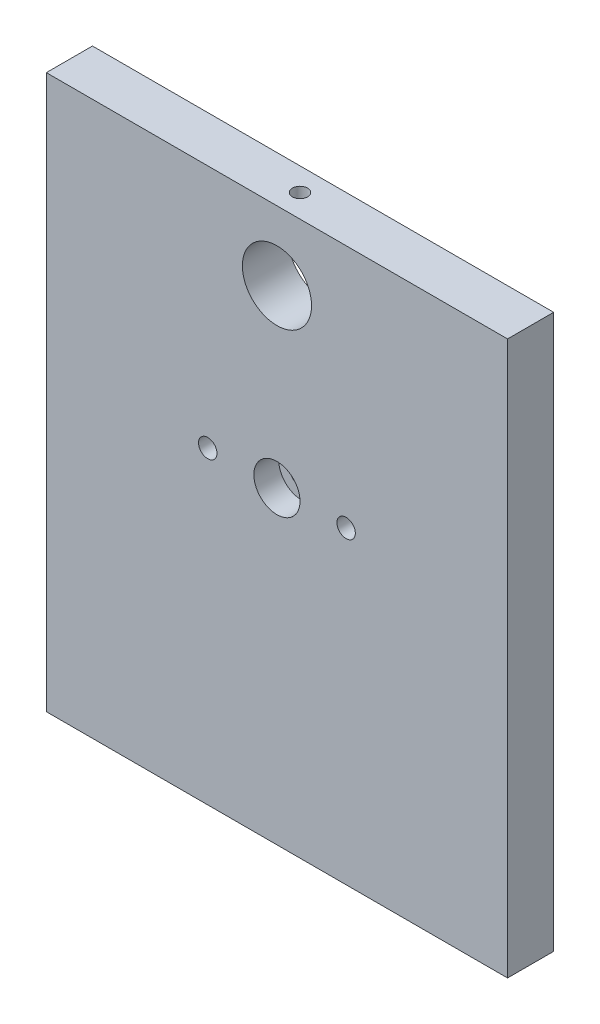
ISO-10303-21;
HEADER;
FILE_DESCRIPTION(('STEP AP214'),'2;1');
FILE_NAME('part.step','',(''),(''),'','','');
FILE_SCHEMA(('AUTOMOTIVE_DESIGN { 1 0 10303 214 1 1 1 1 }'));
ENDSEC;
DATA;
#1=APPLICATION_CONTEXT('core data for automotive mechanical design processes');
#2=APPLICATION_PROTOCOL_DEFINITION('international standard','automotive_design',2000,#1);
#3=PRODUCT_CONTEXT('',#1,'mechanical');
#4=PRODUCT('Part','Part','',(#3));
#5=PRODUCT_RELATED_PRODUCT_CATEGORY('part','',(#4));
#6=PRODUCT_DEFINITION_FORMATION('','',#4);
#7=PRODUCT_DEFINITION_CONTEXT('part definition',#1,'design');
#8=PRODUCT_DEFINITION('design','',#6,#7);
#9=PRODUCT_DEFINITION_SHAPE('','',#8);
#10=(LENGTH_UNIT() NAMED_UNIT(*) SI_UNIT(.MILLI.,.METRE.));
#11=(NAMED_UNIT(*) PLANE_ANGLE_UNIT() SI_UNIT($,.RADIAN.));
#12=(NAMED_UNIT(*) SI_UNIT($,.STERADIAN.) SOLID_ANGLE_UNIT());
#13=UNCERTAINTY_MEASURE_WITH_UNIT(LENGTH_MEASURE(1.E-05),#10,'distance_accuracy_value','');
#14=(GEOMETRIC_REPRESENTATION_CONTEXT(3) GLOBAL_UNCERTAINTY_ASSIGNED_CONTEXT((#13)) GLOBAL_UNIT_ASSIGNED_CONTEXT((#10,
#11,#12)) REPRESENTATION_CONTEXT('',''));
#15=CARTESIAN_POINT('',(0.,0.,0.));
#16=DIRECTION('',(0.,0.,1.));
#17=DIRECTION('',(1.,0.,0.));
#18=AXIS2_PLACEMENT_3D('',#15,#16,#17);
#19=CARTESIAN_POINT('',(-50.,0.,10.));
#20=DIRECTION('',(1.,0.,0.));
#21=DIRECTION('',(0.,0.,-1.));
#22=AXIS2_PLACEMENT_3D('',#19,#20,#21);
#23=PLANE('',#22);
#24=DIRECTION('',(0.,-1.,0.));
#25=VECTOR('',#24,1.);
#26=CARTESIAN_POINT('',(-50.,0.,0.));
#27=LINE('',#26,#25);
#28=CARTESIAN_POINT('',(-50.,120.,0.));
#29=VERTEX_POINT('',#28);
#30=CARTESIAN_POINT('',(-50.,0.,0.));
#31=VERTEX_POINT('',#30);
#32=EDGE_CURVE('E156',#29,#31,#27,.T.);
#33=ORIENTED_EDGE('',*,*,#32,.T.);
#34=DIRECTION('',(0.,0.,-1.));
#35=VECTOR('',#34,1.);
#36=CARTESIAN_POINT('',(-50.,0.,10.));
#37=LINE('',#36,#35);
#38=CARTESIAN_POINT('',(-50.,0.,10.));
#39=VERTEX_POINT('',#38);
#40=EDGE_CURVE('E11',#39,#31,#37,.T.);
#41=ORIENTED_EDGE('',*,*,#40,.F.);
#42=DIRECTION('',(0.,-1.,0.));
#43=VECTOR('',#42,1.);
#44=CARTESIAN_POINT('',(-50.,0.,10.));
#45=LINE('',#44,#43);
#46=CARTESIAN_POINT('',(-50.,120.,10.));
#47=VERTEX_POINT('',#46);
#48=EDGE_CURVE('E157',#47,#39,#45,.T.);
#49=ORIENTED_EDGE('',*,*,#48,.F.);
#50=DIRECTION('',(0.,0.,-1.));
#51=VECTOR('',#50,1.);
#52=CARTESIAN_POINT('',(-50.,120.,10.));
#53=LINE('',#52,#51);
#54=EDGE_CURVE('E167',#47,#29,#53,.T.);
#55=ORIENTED_EDGE('',*,*,#54,.T.);
#56=EDGE_LOOP('',(#33,#41,#49,#55));
#57=FACE_BOUND('',#56,.T.);
#58=ADVANCED_FACE('F44',(#57),#23,.F.);
#59=CARTESIAN_POINT('',(-50.,0.,10.));
#60=DIRECTION('',(0.,1.,0.));
#61=DIRECTION('',(0.,0.,1.));
#62=AXIS2_PLACEMENT_3D('',#59,#60,#61);
#63=PLANE('',#62);
#64=CARTESIAN_POINT('',(0.,0.,5.));
#65=DIRECTION('',(0.,-1.,0.));
#66=DIRECTION('',(0.,0.,-1.));
#67=AXIS2_PLACEMENT_3D('',#64,#65,#66);
#68=CIRCLE('',#67,2.09999999999999);
#69=CARTESIAN_POINT('',(0.,0.,2.90000000000001));
#70=VERTEX_POINT('',#69);
#71=EDGE_CURVE('E128',#70,#70,#68,.T.);
#72=ORIENTED_EDGE('',*,*,#71,.F.);
#73=EDGE_LOOP('',(#72));
#74=FACE_BOUND('',#73,.T.);
#75=CARTESIAN_POINT('',(-35.,0.,5.));
#76=DIRECTION('',(0.,-1.,0.));
#77=DIRECTION('',(0.,0.,-1.));
#78=AXIS2_PLACEMENT_3D('',#75,#76,#77);
#79=CIRCLE('',#78,2.09999999999999);
#80=CARTESIAN_POINT('',(-35.,0.,2.90000000000001));
#81=VERTEX_POINT('',#80);
#82=EDGE_CURVE('E127',#81,#81,#79,.T.);
#83=ORIENTED_EDGE('',*,*,#82,.F.);
#84=EDGE_LOOP('',(#83));
#85=FACE_BOUND('',#84,.T.);
#86=CARTESIAN_POINT('',(35.,0.,5.));
#87=DIRECTION('',(0.,-1.,0.));
#88=DIRECTION('',(0.,0.,-1.));
#89=AXIS2_PLACEMENT_3D('',#86,#87,#88);
#90=CIRCLE('',#89,2.09999999999999);
#91=CARTESIAN_POINT('',(35.,0.,2.90000000000001));
#92=VERTEX_POINT('',#91);
#93=EDGE_CURVE('E143',#92,#92,#90,.T.);
#94=ORIENTED_EDGE('',*,*,#93,.F.);
#95=EDGE_LOOP('',(#94));
#96=FACE_BOUND('',#95,.T.);
#97=DIRECTION('',(1.,0.,0.));
#98=VECTOR('',#97,1.);
#99=CARTESIAN_POINT('',(-50.,0.,0.));
#100=LINE('',#99,#98);
#101=CARTESIAN_POINT('',(50.,0.,0.));
#102=VERTEX_POINT('',#101);
#103=EDGE_CURVE('E171',#31,#102,#100,.T.);
#104=ORIENTED_EDGE('',*,*,#103,.T.);
#105=DIRECTION('',(0.,0.,-1.));
#106=VECTOR('',#105,1.);
#107=CARTESIAN_POINT('',(50.,0.,10.));
#108=LINE('',#107,#106);
#109=CARTESIAN_POINT('',(50.,0.,10.));
#110=VERTEX_POINT('',#109);
#111=EDGE_CURVE('E59',#110,#102,#108,.T.);
#112=ORIENTED_EDGE('',*,*,#111,.F.);
#113=DIRECTION('',(1.,0.,0.));
#114=VECTOR('',#113,1.);
#115=CARTESIAN_POINT('',(-50.,0.,10.));
#116=LINE('',#115,#114);
#117=EDGE_CURVE('E103',#39,#110,#116,.T.);
#118=ORIENTED_EDGE('',*,*,#117,.F.);
#119=ORIENTED_EDGE('',*,*,#40,.T.);
#120=EDGE_LOOP('',(#104,#112,#118,#119));
#121=FACE_BOUND('',#120,.T.);
#122=ADVANCED_FACE('F202',(#74,#85,#96,#121),#63,.F.);
#123=CARTESIAN_POINT('',(50.,0.,10.));
#124=DIRECTION('',(-1.,0.,0.));
#125=DIRECTION('',(0.,0.,1.));
#126=AXIS2_PLACEMENT_3D('',#123,#124,#125);
#127=PLANE('',#126);
#128=DIRECTION('',(0.,1.,0.));
#129=VECTOR('',#128,1.);
#130=CARTESIAN_POINT('',(50.,0.,0.));
#131=LINE('',#130,#129);
#132=CARTESIAN_POINT('',(50.,120.,0.));
#133=VERTEX_POINT('',#132);
#134=EDGE_CURVE('E89',#102,#133,#131,.T.);
#135=ORIENTED_EDGE('',*,*,#134,.T.);
#136=DIRECTION('',(0.,0.,-1.));
#137=VECTOR('',#136,1.);
#138=CARTESIAN_POINT('',(50.,120.,10.));
#139=LINE('',#138,#137);
#140=CARTESIAN_POINT('',(50.,120.,10.));
#141=VERTEX_POINT('',#140);
#142=EDGE_CURVE('E180',#141,#133,#139,.T.);
#143=ORIENTED_EDGE('',*,*,#142,.F.);
#144=DIRECTION('',(0.,1.,0.));
#145=VECTOR('',#144,1.);
#146=CARTESIAN_POINT('',(50.,0.,10.));
#147=LINE('',#146,#145);
#148=EDGE_CURVE('E162',#110,#141,#147,.T.);
#149=ORIENTED_EDGE('',*,*,#148,.F.);
#150=ORIENTED_EDGE('',*,*,#111,.T.);
#151=EDGE_LOOP('',(#135,#143,#149,#150));
#152=FACE_BOUND('',#151,.T.);
#153=ADVANCED_FACE('F184',(#152),#127,.F.);
#154=CARTESIAN_POINT('',(-50.,120.,10.));
#155=DIRECTION('',(0.,-1.,0.));
#156=DIRECTION('',(0.,0.,-1.));
#157=AXIS2_PLACEMENT_3D('',#154,#155,#156);
#158=PLANE('',#157);
#159=CARTESIAN_POINT('',(0.,120.,5.));
#160=DIRECTION('',(0.,1.,0.));
#161=DIRECTION('',(0.,0.,1.));
#162=AXIS2_PLACEMENT_3D('',#159,#160,#161);
#163=CIRCLE('',#162,1.65);
#164=CARTESIAN_POINT('',(0.,120.,6.65));
#165=VERTEX_POINT('',#164);
#166=EDGE_CURVE('E262',#165,#165,#163,.T.);
#167=ORIENTED_EDGE('',*,*,#166,.F.);
#168=EDGE_LOOP('',(#167));
#169=FACE_BOUND('',#168,.T.);
#170=DIRECTION('',(-1.,0.,0.));
#171=VECTOR('',#170,1.);
#172=CARTESIAN_POINT('',(-50.,120.,0.));
#173=LINE('',#172,#171);
#174=EDGE_CURVE('E95',#133,#29,#173,.T.);
#175=ORIENTED_EDGE('',*,*,#174,.T.);
#176=ORIENTED_EDGE('',*,*,#54,.F.);
#177=DIRECTION('',(-1.,0.,0.));
#178=VECTOR('',#177,1.);
#179=CARTESIAN_POINT('',(-50.,120.,10.));
#180=LINE('',#179,#178);
#181=EDGE_CURVE('E70',#141,#47,#180,.T.);
#182=ORIENTED_EDGE('',*,*,#181,.F.);
#183=ORIENTED_EDGE('',*,*,#142,.T.);
#184=EDGE_LOOP('',(#175,#176,#182,#183));
#185=FACE_BOUND('',#184,.T.);
#186=ADVANCED_FACE('F191',(#169,#185),#158,.F.);
#187=CARTESIAN_POINT('',(0.,0.,10.));
#188=DIRECTION('',(0.,0.,-1.));
#189=DIRECTION('',(-1.,0.,0.));
#190=AXIS2_PLACEMENT_3D('',#187,#188,#189);
#191=PLANE('',#190);
#192=CARTESIAN_POINT('',(-15.,67.,10.));
#193=DIRECTION('',(0.,0.,1.));
#194=DIRECTION('',(1.,0.,0.));
#195=AXIS2_PLACEMENT_3D('',#192,#193,#194);
#196=CIRCLE('',#195,2.);
#197=CARTESIAN_POINT('',(-13.,67.,10.));
#198=VERTEX_POINT('',#197);
#199=EDGE_CURVE('E285',#198,#198,#196,.T.);
#200=ORIENTED_EDGE('',*,*,#199,.F.);
#201=EDGE_LOOP('',(#200));
#202=FACE_BOUND('',#201,.T.);
#203=CARTESIAN_POINT('',(15.,67.,10.));
#204=DIRECTION('',(0.,0.,1.));
#205=DIRECTION('',(1.,0.,0.));
#206=AXIS2_PLACEMENT_3D('',#203,#204,#205);
#207=CIRCLE('',#206,2.);
#208=CARTESIAN_POINT('',(17.,67.,10.));
#209=VERTEX_POINT('',#208);
#210=EDGE_CURVE('E280',#209,#209,#207,.T.);
#211=ORIENTED_EDGE('',*,*,#210,.F.);
#212=EDGE_LOOP('',(#211));
#213=FACE_BOUND('',#212,.T.);
#214=CARTESIAN_POINT('',(0.,67.,10.));
#215=DIRECTION('',(0.,0.,1.));
#216=DIRECTION('',(1.,0.,0.));
#217=AXIS2_PLACEMENT_3D('',#214,#215,#216);
#218=CIRCLE('',#217,5.);
#219=CARTESIAN_POINT('',(5.,67.,10.));
#220=VERTEX_POINT('',#219);
#221=EDGE_CURVE('E274',#220,#220,#218,.T.);
#222=ORIENTED_EDGE('',*,*,#221,.F.);
#223=EDGE_LOOP('',(#222));
#224=FACE_BOUND('',#223,.T.);
#225=CARTESIAN_POINT('',(0.,105.,10.));
#226=DIRECTION('',(0.,0.,1.));
#227=DIRECTION('',(1.,0.,0.));
#228=AXIS2_PLACEMENT_3D('',#225,#226,#227);
#229=CIRCLE('',#228,7.5);
#230=CARTESIAN_POINT('',(7.5,105.,10.));
#231=VERTEX_POINT('',#230);
#232=EDGE_CURVE('E150',#231,#231,#229,.T.);
#233=ORIENTED_EDGE('',*,*,#232,.F.);
#234=EDGE_LOOP('',(#233));
#235=FACE_BOUND('',#234,.T.);
#236=ORIENTED_EDGE('',*,*,#48,.T.);
#237=ORIENTED_EDGE('',*,*,#117,.T.);
#238=ORIENTED_EDGE('',*,*,#148,.T.);
#239=ORIENTED_EDGE('',*,*,#181,.T.);
#240=EDGE_LOOP('',(#236,#237,#238,#239));
#241=FACE_BOUND('',#240,.T.);
#242=ADVANCED_FACE('F193',(#202,#213,#224,#235,#241),#191,.F.);
#243=CARTESIAN_POINT('',(0.,0.,0.));
#244=DIRECTION('',(0.,0.,-1.));
#245=DIRECTION('',(-1.,0.,0.));
#246=AXIS2_PLACEMENT_3D('',#243,#244,#245);
#247=PLANE('',#246);
#248=CARTESIAN_POINT('',(-15.,67.,0.));
#249=DIRECTION('',(0.,0.,1.));
#250=DIRECTION('',(1.,0.,0.));
#251=AXIS2_PLACEMENT_3D('',#248,#249,#250);
#252=CIRCLE('',#251,2.);
#253=CARTESIAN_POINT('',(-13.,67.,0.));
#254=VERTEX_POINT('',#253);
#255=EDGE_CURVE('E246',#254,#254,#252,.T.);
#256=ORIENTED_EDGE('',*,*,#255,.T.);
#257=EDGE_LOOP('',(#256));
#258=FACE_BOUND('',#257,.T.);
#259=CARTESIAN_POINT('',(15.,67.,0.));
#260=DIRECTION('',(0.,0.,1.));
#261=DIRECTION('',(1.,0.,0.));
#262=AXIS2_PLACEMENT_3D('',#259,#260,#261);
#263=CIRCLE('',#262,2.);
#264=CARTESIAN_POINT('',(17.,67.,0.));
#265=VERTEX_POINT('',#264);
#266=EDGE_CURVE('E250',#265,#265,#263,.T.);
#267=ORIENTED_EDGE('',*,*,#266,.T.);
#268=EDGE_LOOP('',(#267));
#269=FACE_BOUND('',#268,.T.);
#270=CARTESIAN_POINT('',(0.,67.,0.));
#271=DIRECTION('',(0.,0.,1.));
#272=DIRECTION('',(1.,0.,0.));
#273=AXIS2_PLACEMENT_3D('',#270,#271,#272);
#274=CIRCLE('',#273,2.75);
#275=CARTESIAN_POINT('',(2.75,67.,0.));
#276=VERTEX_POINT('',#275);
#277=EDGE_CURVE('E254',#276,#276,#274,.T.);
#278=ORIENTED_EDGE('',*,*,#277,.T.);
#279=EDGE_LOOP('',(#278));
#280=FACE_BOUND('',#279,.T.);
#281=CARTESIAN_POINT('',(0.,105.,0.));
#282=DIRECTION('',(0.,0.,1.));
#283=DIRECTION('',(1.,0.,0.));
#284=AXIS2_PLACEMENT_3D('',#281,#282,#283);
#285=CIRCLE('',#284,7.5);
#286=CARTESIAN_POINT('',(7.5,105.,0.));
#287=VERTEX_POINT('',#286);
#288=EDGE_CURVE('E153',#287,#287,#285,.T.);
#289=ORIENTED_EDGE('',*,*,#288,.T.);
#290=EDGE_LOOP('',(#289));
#291=FACE_BOUND('',#290,.T.);
#292=ORIENTED_EDGE('',*,*,#32,.F.);
#293=ORIENTED_EDGE('',*,*,#174,.F.);
#294=ORIENTED_EDGE('',*,*,#134,.F.);
#295=ORIENTED_EDGE('',*,*,#103,.F.);
#296=EDGE_LOOP('',(#292,#293,#294,#295));
#297=FACE_BOUND('',#296,.T.);
#298=ADVANCED_FACE('F187',(#258,#269,#280,#291,#297),#247,.T.);
#299=CARTESIAN_POINT('',(0.,105.,10.));
#300=DIRECTION('',(0.,0.,1.));
#301=DIRECTION('',(1.,0.,0.));
#302=AXIS2_PLACEMENT_3D('',#299,#300,#301);
#303=CYLINDRICAL_SURFACE('',#302,7.5);
#304=CARTESIAN_POINT('',(0.,112.5,6.65));
#305=CARTESIAN_POINT('',(0.0914999393408013,112.499998314241,6.64999689388329));
#306=CARTESIAN_POINT('',(0.183037296855733,112.498308549615,6.64236318106866));
#307=CARTESIAN_POINT('',(0.36351102332015,112.491730975333,6.61206225940868));
#308=CARTESIAN_POINT('',(0.452445501715038,112.4868408986,6.58938439323356));
#309=CARTESIAN_POINT('',(0.625079242768204,112.474407058234,6.52974055396921));
#310=CARTESIAN_POINT('',(0.708783898837725,112.466866083454,6.4927895927343));
#311=CARTESIAN_POINT('',(0.868802700314481,112.449943914735,6.40569630891618));
#312=CARTESIAN_POINT('',(0.945117019602319,112.440562764108,6.35555429679659));
#313=CARTESIAN_POINT('',(1.08942970934261,112.420817418265,6.24264148918915));
#314=CARTESIAN_POINT('',(1.15729102940932,112.410440912677,6.17969766887049));
#315=CARTESIAN_POINT('',(1.28158292851941,112.389960900198,6.04333940178755));
#316=CARTESIAN_POINT('',(1.33801247885255,112.379857417946,5.96992401373074));
#317=CARTESIAN_POINT('',(1.43844520787672,112.360945926631,5.81369134292981));
#318=CARTESIAN_POINT('',(1.48230220287273,112.352153686448,5.7307780079661));
#319=CARTESIAN_POINT('',(1.55540709540188,112.337036973031,5.55853274582511));
#320=CARTESIAN_POINT('',(1.58465676165373,112.330712201046,5.46920159724356));
#321=CARTESIAN_POINT('',(1.62726320761459,112.321371953781,5.28814395939664));
#322=CARTESIAN_POINT('',(1.64086278535653,112.318305979859,5.19647726630275));
#323=CARTESIAN_POINT('',(1.65253801366901,112.315678823025,5.01211606415167));
#324=CARTESIAN_POINT('',(1.65061559546281,112.316117204108,4.91942168439077));
#325=CARTESIAN_POINT('',(1.6314967280213,112.320403520243,4.73744348167057));
#326=CARTESIAN_POINT('',(1.61458260643201,112.324188429407,4.64812828725854));
#327=CARTESIAN_POINT('',(1.56640787267831,112.334641659894,4.47363508632754));
#328=CARTESIAN_POINT('',(1.53514644719316,112.341310144681,4.38845731465378));
#329=CARTESIAN_POINT('',(1.45890598688935,112.356841099336,4.22386456484734));
#330=CARTESIAN_POINT('',(1.41381862824298,112.365720786475,4.14450145530904));
#331=CARTESIAN_POINT('',(1.3112823169619,112.384663101412,3.99436318177396));
#332=CARTESIAN_POINT('',(1.25383166066754,112.394725892154,3.92358920346177));
#333=CARTESIAN_POINT('',(1.12670629880249,112.415170817659,3.79101303710661));
#334=CARTESIAN_POINT('',(1.05679158832993,112.425555121687,3.72944109133507));
#335=CARTESIAN_POINT('',(0.907510905058958,112.445272552529,3.61885837608795));
#336=CARTESIAN_POINT('',(0.828144757198043,112.454605659866,3.56984783933175));
#337=CARTESIAN_POINT('',(0.661931267895292,112.471199961066,3.48572123553565));
#338=CARTESIAN_POINT('',(0.575068033653588,112.478456605355,3.45063561420551));
#339=CARTESIAN_POINT('',(0.39648364085885,112.490046571253,3.39562258522818));
#340=CARTESIAN_POINT('',(0.304763199289836,112.494380323027,3.37569294700434));
#341=CARTESIAN_POINT('',(0.121042700683248,112.499574885747,3.35189313774669));
#342=CARTESIAN_POINT('',(0.0290852501339724,112.500503693889,3.34770849163739));
#343=CARTESIAN_POINT('',(-0.154214783533878,112.498974383699,3.35466469502871));
#344=CARTESIAN_POINT('',(-0.245557408436372,112.496516497911,3.36580449228459));
#345=CARTESIAN_POINT('',(-0.423991007748931,112.488532910116,3.40283265132216));
#346=CARTESIAN_POINT('',(-0.511117938303426,112.483041587791,3.42855581582791));
#347=CARTESIAN_POINT('',(-0.679820246095634,112.469605878242,3.49383695756339));
#348=CARTESIAN_POINT('',(-0.761395145868542,112.461661280365,3.5333961228733));
#349=CARTESIAN_POINT('',(-0.917976261781452,112.444032703715,3.62587978321851));
#350=CARTESIAN_POINT('',(-0.99287085950515,112.434325305942,3.6789886922759));
#351=CARTESIAN_POINT('',(-1.13279771208182,112.414295274034,3.79682171018652));
#352=CARTESIAN_POINT('',(-1.19782866797858,112.403972559116,3.86154734641592));
#353=CARTESIAN_POINT('',(-1.3174275998863,112.383640077133,4.00222027859977));
#354=CARTESIAN_POINT('',(-1.37177769648958,112.373639743821,4.07835443129549));
#355=CARTESIAN_POINT('',(-1.46692164784539,112.355304075691,4.23885442521818));
#356=CARTESIAN_POINT('',(-1.50771609134851,112.346968668569,4.32321990873516));
#357=CARTESIAN_POINT('',(-1.57431369753847,112.332986792121,4.49733416930289));
#358=CARTESIAN_POINT('',(-1.60020149826091,112.327325175037,4.58704929627586));
#359=CARTESIAN_POINT('',(-1.63649815552641,112.319304996437,4.76969698070692));
#360=CARTESIAN_POINT('',(-1.64690952060538,112.316945899627,4.8626290142455));
#361=CARTESIAN_POINT('',(-1.6518500388516,112.315831876572,5.04687496928519));
#362=CARTESIAN_POINT('',(-1.64672474541726,112.316998531717,5.13817931994233));
#363=CARTESIAN_POINT('',(-1.62151064971412,112.322627058637,5.31858911375489));
#364=CARTESIAN_POINT('',(-1.60142202805462,112.32708889064,5.40769458343767));
#365=CARTESIAN_POINT('',(-1.54701934318006,112.338766590513,5.58089887364454));
#366=CARTESIAN_POINT('',(-1.5127561284581,112.345972606906,5.66501437374034));
#367=CARTESIAN_POINT('',(-1.4310203389896,112.362330494306,5.82635416226081));
#368=CARTESIAN_POINT('',(-1.38354636957811,112.371482570735,5.90357772196298));
#369=CARTESIAN_POINT('',(-1.27559296460683,112.390935215414,6.05064370885943));
#370=CARTESIAN_POINT('',(-1.21486750796967,112.401255436815,6.12030297965252));
#371=CARTESIAN_POINT('',(-1.08263275210779,112.421750079978,6.2485559345428));
#372=CARTESIAN_POINT('',(-1.01112096165039,112.431924467463,6.30714705525868));
#373=CARTESIAN_POINT('',(-0.858209468643989,112.451139887262,6.41233915166255));
#374=CARTESIAN_POINT('',(-0.776692042971306,112.460164245538,6.45877221861649));
#375=CARTESIAN_POINT('',(-0.606827789468279,112.475895238877,6.53720389832133));
#376=CARTESIAN_POINT('',(-0.51848673019753,112.482603805978,6.56921455037323));
#377=CARTESIAN_POINT('',(-0.358388456603653,112.491758115147,6.61222376891093));
#378=CARTESIAN_POINT('',(-0.287493809384326,112.494829600129,6.62636269380083));
#379=CARTESIAN_POINT('',(-0.144407171386656,112.498951162006,6.64525182243697));
#380=CARTESIAN_POINT('',(-0.0722152395237924,112.500001330465,6.65000245146569));
#381=CARTESIAN_POINT('',(0.,112.5,6.65));
#382=B_SPLINE_CURVE_WITH_KNOTS('',3,(#304,#305,#306,#307,#308,#309,#310,#311,#312,#313,#314,
#315,#316,#317,#318,#319,#320,#321,#322,#323,#324,#325,#326,#327,#328,#329,#330,#331,#332,#333,
#334,#335,#336,#337,#338,#339,#340,#341,#342,#343,#344,#345,#346,#347,#348,#349,#350,#351,#352,
#353,#354,#355,#356,#357,#358,#359,#360,#361,#362,#363,#364,#365,#366,#367,#368,#369,#370,#371,
#372,#373,#374,#375,#376,#377,#378,#379,#380,#381),.UNSPECIFIED.,.T.,.F.,(4,2,2,2,2,2,2,2,2,2,2,
2,2,2,2,2,2,2,2,2,2,2,2,2,2,2,2,2,2,2,2,2,2,2,2,2,2,2,4),(0.,0.274235469748509,
0.548665416592523,0.822807511778605,1.09694315535338,1.37506480293447,1.65321146673233,
1.93447194708655,2.21569836294015,2.49250033112996,2.76926786056845,3.04093142111883,
3.31261038365023,3.5864747765339,3.86037693206286,4.14027337309169,4.42017499925702,
4.70068528026746,4.98115426927862,5.25599076583746,5.53080839183636,5.80257342230782,
6.07436179463613,6.35006739343504,6.62580926880844,6.9066964172031,7.18757136448181,
7.46683540152299,7.7460541684323,8.01910869065849,8.2921599171344,8.56424000622433,
8.83634882982831,9.11402013989236,9.39175567994317,9.67314563039331,9.95430024968247,
10.1707471396203,10.3871842244587),.UNSPECIFIED.);
#383=CARTESIAN_POINT('',(0.,112.5,6.65));
#384=VERTEX_POINT('',#383);
#385=EDGE_CURVE('E47',#384,#384,#382,.T.);
#386=ORIENTED_EDGE('',*,*,#385,.T.);
#387=EDGE_LOOP('',(#386));
#388=FACE_BOUND('',#387,.T.);
#389=ORIENTED_EDGE('',*,*,#288,.F.);
#390=EDGE_LOOP('',(#389));
#391=FACE_BOUND('',#390,.T.);
#392=ORIENTED_EDGE('',*,*,#232,.T.);
#393=EDGE_LOOP('',(#392));
#394=FACE_BOUND('',#393,.T.);
#395=ADVANCED_FACE('F231',(#388,#391,#394),#303,.F.);
#396=CARTESIAN_POINT('',(35.,14.,5.));
#397=DIRECTION('',(0.,-1.,0.));
#398=DIRECTION('',(0.,0.,-1.));
#399=AXIS2_PLACEMENT_3D('',#396,#397,#398);
#400=CONICAL_SURFACE('',#399,2.09999999999999,1.02974425867665);
#401=CARTESIAN_POINT('',(35.,15.2618072999579,5.));
#402=VERTEX_POINT('',#401);
#403=VERTEX_LOOP('',#402);
#404=FACE_BOUND('',#403,.T.);
#405=CARTESIAN_POINT('',(35.,14.,5.));
#406=DIRECTION('',(0.,-1.,0.));
#407=DIRECTION('',(0.,0.,-1.));
#408=AXIS2_PLACEMENT_3D('',#405,#406,#407);
#409=CIRCLE('',#408,2.09999999999999);
#410=CARTESIAN_POINT('',(35.,14.,2.90000000000001));
#411=VERTEX_POINT('',#410);
#412=EDGE_CURVE('E146',#411,#411,#409,.T.);
#413=ORIENTED_EDGE('',*,*,#412,.T.);
#414=EDGE_LOOP('',(#413));
#415=FACE_BOUND('',#414,.T.);
#416=ADVANCED_FACE('F222',(#404,#415),#400,.F.);
#417=CARTESIAN_POINT('',(35.,0.,5.));
#418=DIRECTION('',(0.,-1.,0.));
#419=DIRECTION('',(0.,0.,-1.));
#420=AXIS2_PLACEMENT_3D('',#417,#418,#419);
#421=CYLINDRICAL_SURFACE('',#420,2.09999999999999);
#422=ORIENTED_EDGE('',*,*,#412,.F.);
#423=EDGE_LOOP('',(#422));
#424=FACE_BOUND('',#423,.T.);
#425=ORIENTED_EDGE('',*,*,#93,.T.);
#426=EDGE_LOOP('',(#425));
#427=FACE_BOUND('',#426,.T.);
#428=ADVANCED_FACE('F219',(#424,#427),#421,.F.);
#429=CARTESIAN_POINT('',(-35.,14.,5.));
#430=DIRECTION('',(0.,-1.,0.));
#431=DIRECTION('',(0.,0.,-1.));
#432=AXIS2_PLACEMENT_3D('',#429,#430,#431);
#433=CONICAL_SURFACE('',#432,2.09999999999999,1.02974425867665);
#434=CARTESIAN_POINT('',(-35.,15.2618072999579,5.));
#435=VERTEX_POINT('',#434);
#436=VERTEX_LOOP('',#435);
#437=FACE_BOUND('',#436,.T.);
#438=CARTESIAN_POINT('',(-35.,14.,5.));
#439=DIRECTION('',(0.,-1.,0.));
#440=DIRECTION('',(0.,0.,-1.));
#441=AXIS2_PLACEMENT_3D('',#438,#439,#440);
#442=CIRCLE('',#441,2.09999999999999);
#443=CARTESIAN_POINT('',(-35.,14.,2.90000000000001));
#444=VERTEX_POINT('',#443);
#445=EDGE_CURVE('E134',#444,#444,#442,.T.);
#446=ORIENTED_EDGE('',*,*,#445,.T.);
#447=EDGE_LOOP('',(#446));
#448=FACE_BOUND('',#447,.T.);
#449=ADVANCED_FACE('F221',(#437,#448),#433,.F.);
#450=CARTESIAN_POINT('',(-35.,0.,5.));
#451=DIRECTION('',(0.,-1.,0.));
#452=DIRECTION('',(0.,0.,-1.));
#453=AXIS2_PLACEMENT_3D('',#450,#451,#452);
#454=CYLINDRICAL_SURFACE('',#453,2.09999999999999);
#455=ORIENTED_EDGE('',*,*,#445,.F.);
#456=EDGE_LOOP('',(#455));
#457=FACE_BOUND('',#456,.T.);
#458=ORIENTED_EDGE('',*,*,#82,.T.);
#459=EDGE_LOOP('',(#458));
#460=FACE_BOUND('',#459,.T.);
#461=ADVANCED_FACE('F120',(#457,#460),#454,.F.);
#462=CARTESIAN_POINT('',(0.,14.,5.));
#463=DIRECTION('',(0.,-1.,0.));
#464=DIRECTION('',(0.,0.,-1.));
#465=AXIS2_PLACEMENT_3D('',#462,#463,#464);
#466=CONICAL_SURFACE('',#465,2.09999999999999,1.02974425867665);
#467=CARTESIAN_POINT('',(0.,15.2618072999579,5.));
#468=VERTEX_POINT('',#467);
#469=VERTEX_LOOP('',#468);
#470=FACE_BOUND('',#469,.T.);
#471=CARTESIAN_POINT('',(0.,14.,5.));
#472=DIRECTION('',(0.,-1.,0.));
#473=DIRECTION('',(0.,0.,-1.));
#474=AXIS2_PLACEMENT_3D('',#471,#472,#473);
#475=CIRCLE('',#474,2.09999999999999);
#476=CARTESIAN_POINT('',(0.,14.,2.90000000000001));
#477=VERTEX_POINT('',#476);
#478=EDGE_CURVE('E124',#477,#477,#475,.T.);
#479=ORIENTED_EDGE('',*,*,#478,.T.);
#480=EDGE_LOOP('',(#479));
#481=FACE_BOUND('',#480,.T.);
#482=ADVANCED_FACE('F116',(#470,#481),#466,.F.);
#483=CARTESIAN_POINT('',(0.,0.,5.));
#484=DIRECTION('',(0.,-1.,0.));
#485=DIRECTION('',(0.,0.,-1.));
#486=AXIS2_PLACEMENT_3D('',#483,#484,#485);
#487=CYLINDRICAL_SURFACE('',#486,2.09999999999999);
#488=ORIENTED_EDGE('',*,*,#478,.F.);
#489=EDGE_LOOP('',(#488));
#490=FACE_BOUND('',#489,.T.);
#491=ORIENTED_EDGE('',*,*,#71,.T.);
#492=EDGE_LOOP('',(#491));
#493=FACE_BOUND('',#492,.T.);
#494=ADVANCED_FACE('F119',(#490,#493),#487,.F.);
#495=CARTESIAN_POINT('',(0.,120.,5.));
#496=DIRECTION('',(0.,1.,0.));
#497=DIRECTION('',(0.,0.,1.));
#498=AXIS2_PLACEMENT_3D('',#495,#496,#497);
#499=CYLINDRICAL_SURFACE('',#498,1.65);
#500=ORIENTED_EDGE('',*,*,#166,.T.);
#501=EDGE_LOOP('',(#500));
#502=FACE_BOUND('',#501,.T.);
#503=ORIENTED_EDGE('',*,*,#385,.F.);
#504=EDGE_LOOP('',(#503));
#505=FACE_BOUND('',#504,.T.);
#506=ADVANCED_FACE('F314',(#502,#505),#499,.F.);
#507=CARTESIAN_POINT('',(0.,67.,10.));
#508=DIRECTION('',(0.,0.,1.));
#509=DIRECTION('',(1.,0.,0.));
#510=AXIS2_PLACEMENT_3D('',#507,#508,#509);
#511=CYLINDRICAL_SURFACE('',#510,2.75);
#512=ORIENTED_EDGE('',*,*,#277,.F.);
#513=EDGE_LOOP('',(#512));
#514=FACE_BOUND('',#513,.T.);
#515=CARTESIAN_POINT('',(0.,67.,4.6));
#516=DIRECTION('',(0.,0.,1.));
#517=DIRECTION('',(1.,0.,0.));
#518=AXIS2_PLACEMENT_3D('',#515,#516,#517);
#519=CIRCLE('',#518,2.75);
#520=CARTESIAN_POINT('',(2.75,67.,4.6));
#521=VERTEX_POINT('',#520);
#522=EDGE_CURVE('E263',#521,#521,#519,.T.);
#523=ORIENTED_EDGE('',*,*,#522,.T.);
#524=EDGE_LOOP('',(#523));
#525=FACE_BOUND('',#524,.T.);
#526=ADVANCED_FACE('F307',(#514,#525),#511,.F.);
#527=CARTESIAN_POINT('',(2.75,67.,4.6));
#528=DIRECTION('',(0.,0.,-1.));
#529=DIRECTION('',(-1.,0.,0.));
#530=AXIS2_PLACEMENT_3D('',#527,#528,#529);
#531=PLANE('',#530);
#532=ORIENTED_EDGE('',*,*,#522,.F.);
#533=EDGE_LOOP('',(#532));
#534=FACE_BOUND('',#533,.T.);
#535=CARTESIAN_POINT('',(0.,67.,4.6));
#536=DIRECTION('',(0.,0.,1.));
#537=DIRECTION('',(1.,0.,0.));
#538=AXIS2_PLACEMENT_3D('',#535,#536,#537);
#539=CIRCLE('',#538,5.);
#540=CARTESIAN_POINT('',(5.,67.,4.6));
#541=VERTEX_POINT('',#540);
#542=EDGE_CURVE('E268',#541,#541,#539,.T.);
#543=ORIENTED_EDGE('',*,*,#542,.T.);
#544=EDGE_LOOP('',(#543));
#545=FACE_BOUND('',#544,.T.);
#546=ADVANCED_FACE('F298',(#534,#545),#531,.F.);
#547=CARTESIAN_POINT('',(0.,67.,10.));
#548=DIRECTION('',(0.,0.,1.));
#549=DIRECTION('',(1.,0.,0.));
#550=AXIS2_PLACEMENT_3D('',#547,#548,#549);
#551=CYLINDRICAL_SURFACE('',#550,5.);
#552=ORIENTED_EDGE('',*,*,#542,.F.);
#553=EDGE_LOOP('',(#552));
#554=FACE_BOUND('',#553,.T.);
#555=ORIENTED_EDGE('',*,*,#221,.T.);
#556=EDGE_LOOP('',(#555));
#557=FACE_BOUND('',#556,.T.);
#558=ADVANCED_FACE('F295',(#554,#557),#551,.F.);
#559=CARTESIAN_POINT('',(15.,67.,10.));
#560=DIRECTION('',(0.,0.,1.));
#561=DIRECTION('',(1.,0.,0.));
#562=AXIS2_PLACEMENT_3D('',#559,#560,#561);
#563=CYLINDRICAL_SURFACE('',#562,2.);
#564=ORIENTED_EDGE('',*,*,#266,.F.);
#565=EDGE_LOOP('',(#564));
#566=FACE_BOUND('',#565,.T.);
#567=ORIENTED_EDGE('',*,*,#210,.T.);
#568=EDGE_LOOP('',(#567));
#569=FACE_BOUND('',#568,.T.);
#570=ADVANCED_FACE('F297',(#566,#569),#563,.F.);
#571=CARTESIAN_POINT('',(-15.,67.,10.));
#572=DIRECTION('',(0.,0.,1.));
#573=DIRECTION('',(1.,0.,0.));
#574=AXIS2_PLACEMENT_3D('',#571,#572,#573);
#575=CYLINDRICAL_SURFACE('',#574,2.);
#576=ORIENTED_EDGE('',*,*,#255,.F.);
#577=EDGE_LOOP('',(#576));
#578=FACE_BOUND('',#577,.T.);
#579=ORIENTED_EDGE('',*,*,#199,.T.);
#580=EDGE_LOOP('',(#579));
#581=FACE_BOUND('',#580,.T.);
#582=ADVANCED_FACE('F289',(#578,#581),#575,.F.);
#583=CLOSED_SHELL('',(#58,#122,#153,#186,#242,#298,#395,#416,#428,#449,#461,#482,#494,#506,#526,
#546,#558,#570,#582));
#584=MANIFOLD_SOLID_BREP('B2',#583);
#585=ADVANCED_BREP_SHAPE_REPRESENTATION('',(#18,#584),#14);
#586=SHAPE_DEFINITION_REPRESENTATION(#9,#585);
ENDSEC;
END-ISO-10303-21;
